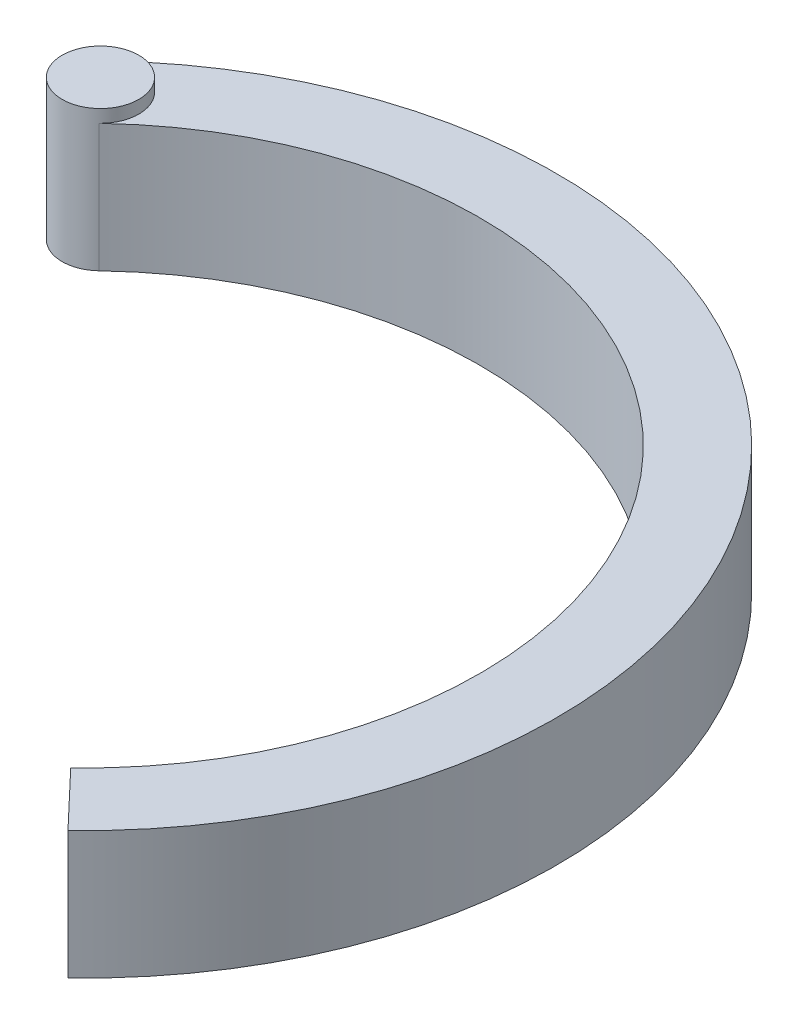
ISO-10303-21;
HEADER;
FILE_DESCRIPTION(('STEP AP214'),'2;1');
FILE_NAME('part.step','',(''),(''),'','','');
FILE_SCHEMA(('AUTOMOTIVE_DESIGN { 1 0 10303 214 1 1 1 1 }'));
ENDSEC;
DATA;
#1=APPLICATION_CONTEXT('core data for automotive mechanical design processes');
#2=APPLICATION_PROTOCOL_DEFINITION('international standard','automotive_design',2000,#1);
#3=PRODUCT_CONTEXT('',#1,'mechanical');
#4=PRODUCT('Part','Part','',(#3));
#5=PRODUCT_RELATED_PRODUCT_CATEGORY('part','',(#4));
#6=PRODUCT_DEFINITION_FORMATION('','',#4);
#7=PRODUCT_DEFINITION_CONTEXT('part definition',#1,'design');
#8=PRODUCT_DEFINITION('design','',#6,#7);
#9=PRODUCT_DEFINITION_SHAPE('','',#8);
#10=(LENGTH_UNIT() NAMED_UNIT(*) SI_UNIT(.MILLI.,.METRE.));
#11=(NAMED_UNIT(*) PLANE_ANGLE_UNIT() SI_UNIT($,.RADIAN.));
#12=(NAMED_UNIT(*) SI_UNIT($,.STERADIAN.) SOLID_ANGLE_UNIT());
#13=UNCERTAINTY_MEASURE_WITH_UNIT(LENGTH_MEASURE(1.E-05),#10,'distance_accuracy_value','');
#14=(GEOMETRIC_REPRESENTATION_CONTEXT(3) GLOBAL_UNCERTAINTY_ASSIGNED_CONTEXT((#13)) GLOBAL_UNIT_ASSIGNED_CONTEXT((#10,
#11,#12)) REPRESENTATION_CONTEXT('',''));
#15=CARTESIAN_POINT('',(0.,0.,0.));
#16=DIRECTION('',(0.,0.,1.));
#17=DIRECTION('',(1.,0.,0.));
#18=AXIS2_PLACEMENT_3D('',#15,#16,#17);
#19=CARTESIAN_POINT('',(35.0398196981464,10.,36.8672065353125));
#20=DIRECTION('',(0.,1.,0.));
#21=DIRECTION('',(0.,0.,1.));
#22=AXIS2_PLACEMENT_3D('',#19,#20,#21);
#23=PLANE('',#22);
#24=CARTESIAN_POINT('',(23.3598797987642,10.,24.5781376902083));
#25=DIRECTION('',(0.,-1.,0.));
#26=DIRECTION('',(0.,0.,1.));
#27=AXIS2_PLACEMENT_3D('',#24,#25,#26);
#28=CIRCLE('',#27,30.9082414249331);
#29=CARTESIAN_POINT('',(2.06674355411314,10.,2.17452778357321));
#30=VERTEX_POINT('',#29);
#31=CARTESIAN_POINT('',(44.6530160434153,10.,46.9817475968434));
#32=VERTEX_POINT('',#31);
#33=EDGE_CURVE('E95',#30,#32,#28,.T.);
#34=ORIENTED_EDGE('',*,*,#33,.T.);
#35=DIRECTION('',(0.688914518037714,0.,0.724842594524401));
#36=VECTOR('',#35,1.);
#37=CARTESIAN_POINT('',(35.0398196981464,10.,36.8672065353125));
#38=LINE('',#37,#36);
#39=CARTESIAN_POINT('',(48.7865031516416,10.,51.3308031639898));
#40=VERTEX_POINT('',#39);
#41=EDGE_CURVE('E121',#32,#40,#38,.T.);
#42=ORIENTED_EDGE('',*,*,#41,.T.);
#43=CARTESIAN_POINT('',(23.3598797987642,10.,24.5781376902083));
#44=DIRECTION('',(0.,1.,0.));
#45=DIRECTION('',(0.,0.,1.));
#46=AXIS2_PLACEMENT_3D('',#43,#44,#45);
#47=CIRCLE('',#46,36.9082414249331);
#48=CARTESIAN_POINT('',(-2.06674355411312,10.,-2.17452778357322));
#49=VERTEX_POINT('',#48);
#50=EDGE_CURVE('E60',#40,#49,#47,.T.);
#51=ORIENTED_EDGE('',*,*,#50,.T.);
#52=CARTESIAN_POINT('',(0.,10.,0.));
#53=DIRECTION('',(0.,1.,0.));
#54=DIRECTION('',(0.,0.,1.));
#55=AXIS2_PLACEMENT_3D('',#52,#53,#54);
#56=CIRCLE('',#55,3.);
#57=EDGE_CURVE('E124',#30,#49,#56,.T.);
#58=ORIENTED_EDGE('',*,*,#57,.F.);
#59=EDGE_LOOP('',(#34,#42,#51,#58));
#60=FACE_BOUND('',#59,.T.);
#61=ADVANCED_FACE('F43',(#60),#23,.T.);
#62=CARTESIAN_POINT('',(35.0398196981464,0.,36.8672065353125));
#63=DIRECTION('',(0.,1.,0.));
#64=DIRECTION('',(0.,0.,1.));
#65=AXIS2_PLACEMENT_3D('',#62,#63,#64);
#66=PLANE('',#65);
#67=DIRECTION('',(0.688914518037714,0.,0.724842594524401));
#68=VECTOR('',#67,1.);
#69=CARTESIAN_POINT('',(35.0398196981464,0.,36.8672065353125));
#70=LINE('',#69,#68);
#71=CARTESIAN_POINT('',(44.6530160434153,0.,46.9817475968434));
#72=VERTEX_POINT('',#71);
#73=CARTESIAN_POINT('',(48.7865031516416,0.,51.3308031639898));
#74=VERTEX_POINT('',#73);
#75=EDGE_CURVE('E11',#72,#74,#70,.T.);
#76=ORIENTED_EDGE('',*,*,#75,.F.);
#77=CARTESIAN_POINT('',(23.3598797987642,0.,24.5781376902083));
#78=DIRECTION('',(0.,-1.,0.));
#79=DIRECTION('',(0.,0.,1.));
#80=AXIS2_PLACEMENT_3D('',#77,#78,#79);
#81=CIRCLE('',#80,30.9082414249331);
#82=CARTESIAN_POINT('',(2.06674355411314,0.,2.17452778357321));
#83=VERTEX_POINT('',#82);
#84=EDGE_CURVE('E86',#83,#72,#81,.T.);
#85=ORIENTED_EDGE('',*,*,#84,.F.);
#86=CARTESIAN_POINT('',(0.,0.,0.));
#87=DIRECTION('',(0.,1.,0.));
#88=DIRECTION('',(0.,0.,1.));
#89=AXIS2_PLACEMENT_3D('',#86,#87,#88);
#90=CIRCLE('',#89,3.);
#91=CARTESIAN_POINT('',(-2.06674355411312,0.,-2.17452778357322));
#92=VERTEX_POINT('',#91);
#93=EDGE_CURVE('E75',#92,#83,#90,.T.);
#94=ORIENTED_EDGE('',*,*,#93,.F.);
#95=CARTESIAN_POINT('',(23.3598797987642,0.,24.5781376902083));
#96=DIRECTION('',(0.,1.,0.));
#97=DIRECTION('',(0.,0.,1.));
#98=AXIS2_PLACEMENT_3D('',#95,#96,#97);
#99=CIRCLE('',#98,36.9082414249331);
#100=EDGE_CURVE('E87',#74,#92,#99,.T.);
#101=ORIENTED_EDGE('',*,*,#100,.F.);
#102=EDGE_LOOP('',(#76,#85,#94,#101));
#103=FACE_BOUND('',#102,.T.);
#104=ADVANCED_FACE('F100',(#103),#66,.F.);
#105=CARTESIAN_POINT('',(23.3598797987642,10.,24.5781376902083));
#106=DIRECTION('',(0.,-1.,0.));
#107=DIRECTION('',(0.,0.,-1.));
#108=AXIS2_PLACEMENT_3D('',#105,#106,#107);
#109=CYLINDRICAL_SURFACE('',#108,36.9082414249331);
#110=ORIENTED_EDGE('',*,*,#100,.T.);
#111=DIRECTION('',(0.,-1.,0.));
#112=VECTOR('',#111,1.);
#113=CARTESIAN_POINT('',(-2.06674355411312,10.,-2.17452778357322));
#114=LINE('',#113,#112);
#115=EDGE_CURVE('E81',#49,#92,#114,.T.);
#116=ORIENTED_EDGE('',*,*,#115,.F.);
#117=ORIENTED_EDGE('',*,*,#50,.F.);
#118=DIRECTION('',(0.,-1.,0.));
#119=VECTOR('',#118,1.);
#120=CARTESIAN_POINT('',(48.7865031516416,10.,51.3308031639898));
#121=LINE('',#120,#119);
#122=EDGE_CURVE('E53',#40,#74,#121,.T.);
#123=ORIENTED_EDGE('',*,*,#122,.T.);
#124=EDGE_LOOP('',(#110,#116,#117,#123));
#125=FACE_BOUND('',#124,.T.);
#126=ADVANCED_FACE('F45',(#125),#109,.T.);
#127=CARTESIAN_POINT('',(0.,10.,0.));
#128=DIRECTION('',(0.,-1.,0.));
#129=DIRECTION('',(0.,0.,-1.));
#130=AXIS2_PLACEMENT_3D('',#127,#128,#129);
#131=CYLINDRICAL_SURFACE('',#130,3.);
#132=ORIENTED_EDGE('',*,*,#93,.T.);
#133=DIRECTION('',(0.,-1.,0.));
#134=VECTOR('',#133,1.);
#135=CARTESIAN_POINT('',(2.06674355411314,10.,2.17452778357321));
#136=LINE('',#135,#134);
#137=EDGE_CURVE('E80',#30,#83,#136,.T.);
#138=ORIENTED_EDGE('',*,*,#137,.F.);
#139=ORIENTED_EDGE('',*,*,#57,.T.);
#140=ORIENTED_EDGE('',*,*,#115,.T.);
#141=EDGE_LOOP('',(#132,#138,#139,#140));
#142=FACE_BOUND('',#141,.T.);
#143=CARTESIAN_POINT('',(0.,11.,0.));
#144=DIRECTION('',(0.,1.,0.));
#145=DIRECTION('',(0.,0.,1.));
#146=AXIS2_PLACEMENT_3D('',#143,#144,#145);
#147=CIRCLE('',#146,3.);
#148=CARTESIAN_POINT('',(0.,11.,3.));
#149=VERTEX_POINT('',#148);
#150=EDGE_CURVE('E127',#149,#149,#147,.T.);
#151=ORIENTED_EDGE('',*,*,#150,.F.);
#152=EDGE_LOOP('',(#151));
#153=FACE_BOUND('',#152,.T.);
#154=ADVANCED_FACE('F77',(#142,#153),#131,.T.);
#155=CARTESIAN_POINT('',(23.3598797987642,10.,24.5781376902083));
#156=DIRECTION('',(0.,-1.,0.));
#157=DIRECTION('',(0.,0.,-1.));
#158=AXIS2_PLACEMENT_3D('',#155,#156,#157);
#159=CYLINDRICAL_SURFACE('',#158,30.9082414249331);
#160=ORIENTED_EDGE('',*,*,#84,.T.);
#161=DIRECTION('',(0.,-1.,0.));
#162=VECTOR('',#161,1.);
#163=CARTESIAN_POINT('',(44.6530160434153,10.,46.9817475968434));
#164=LINE('',#163,#162);
#165=EDGE_CURVE('E97',#32,#72,#164,.T.);
#166=ORIENTED_EDGE('',*,*,#165,.F.);
#167=ORIENTED_EDGE('',*,*,#33,.F.);
#168=ORIENTED_EDGE('',*,*,#137,.T.);
#169=EDGE_LOOP('',(#160,#166,#167,#168));
#170=FACE_BOUND('',#169,.T.);
#171=ADVANCED_FACE('F92',(#170),#159,.F.);
#172=CARTESIAN_POINT('',(0.,11.,0.));
#173=DIRECTION('',(0.,1.,0.));
#174=DIRECTION('',(0.,0.,1.));
#175=AXIS2_PLACEMENT_3D('',#172,#173,#174);
#176=PLANE('',#175);
#177=ORIENTED_EDGE('',*,*,#150,.T.);
#178=EDGE_LOOP('',(#177));
#179=FACE_BOUND('',#178,.T.);
#180=ADVANCED_FACE('F137',(#179),#176,.T.);
#181=CARTESIAN_POINT('',(44.6530160434153,58.,46.9817475968434));
#182=DIRECTION('',(-0.724842594524401,0.,0.688914518037714));
#183=DIRECTION('',(0.688914518037714,0.,0.724842594524401));
#184=AXIS2_PLACEMENT_3D('',#181,#182,#183);
#185=PLANE('',#184);
#186=ORIENTED_EDGE('',*,*,#165,.T.);
#187=ORIENTED_EDGE('',*,*,#75,.T.);
#188=ORIENTED_EDGE('',*,*,#122,.F.);
#189=ORIENTED_EDGE('',*,*,#41,.F.);
#190=EDGE_LOOP('',(#186,#187,#188,#189));
#191=FACE_BOUND('',#190,.T.);
#192=ADVANCED_FACE('F120',(#191),#185,.T.);
#193=CLOSED_SHELL('',(#61,#104,#126,#154,#171,#180,#192));
#194=MANIFOLD_SOLID_BREP('B2',#193);
#195=ADVANCED_BREP_SHAPE_REPRESENTATION('',(#18,#194),#14);
#196=SHAPE_DEFINITION_REPRESENTATION(#9,#195);
ENDSEC;
END-ISO-10303-21;
